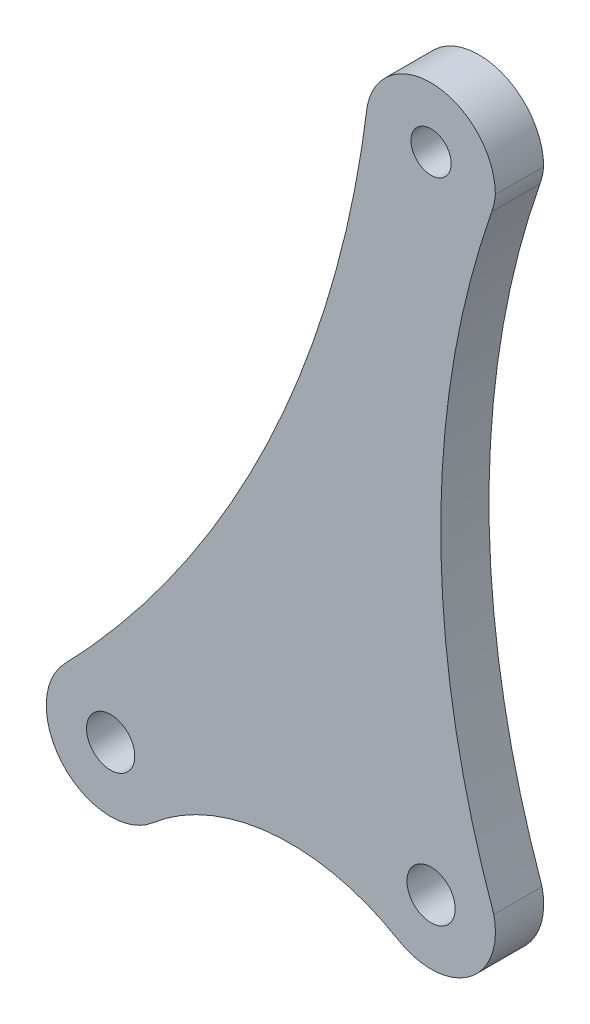
ISO-10303-21;
HEADER;
FILE_DESCRIPTION(('STEP AP214'),'2;1');
FILE_NAME('part.step','',(''),(''),'','','');
FILE_SCHEMA(('AUTOMOTIVE_DESIGN { 1 0 10303 214 1 1 1 1 }'));
ENDSEC;
DATA;
#1=APPLICATION_CONTEXT('core data for automotive mechanical design processes');
#2=APPLICATION_PROTOCOL_DEFINITION('international standard','automotive_design',2000,#1);
#3=PRODUCT_CONTEXT('',#1,'mechanical');
#4=PRODUCT('Part','Part','',(#3));
#5=PRODUCT_RELATED_PRODUCT_CATEGORY('part','',(#4));
#6=PRODUCT_DEFINITION_FORMATION('','',#4);
#7=PRODUCT_DEFINITION_CONTEXT('part definition',#1,'design');
#8=PRODUCT_DEFINITION('design','',#6,#7);
#9=PRODUCT_DEFINITION_SHAPE('','',#8);
#10=(LENGTH_UNIT() NAMED_UNIT(*) SI_UNIT(.MILLI.,.METRE.));
#11=(NAMED_UNIT(*) PLANE_ANGLE_UNIT() SI_UNIT($,.RADIAN.));
#12=(NAMED_UNIT(*) SI_UNIT($,.STERADIAN.) SOLID_ANGLE_UNIT());
#13=UNCERTAINTY_MEASURE_WITH_UNIT(LENGTH_MEASURE(1.E-05),#10,'distance_accuracy_value','');
#14=(GEOMETRIC_REPRESENTATION_CONTEXT(3) GLOBAL_UNCERTAINTY_ASSIGNED_CONTEXT((#13)) GLOBAL_UNIT_ASSIGNED_CONTEXT((#10,
#11,#12)) REPRESENTATION_CONTEXT('',''));
#15=CARTESIAN_POINT('',(0.,0.,0.));
#16=DIRECTION('',(0.,0.,1.));
#17=DIRECTION('',(1.,0.,0.));
#18=AXIS2_PLACEMENT_3D('',#15,#16,#17);
#19=CARTESIAN_POINT('',(23.6265103089509,92.6258355166875,3.));
#20=DIRECTION('',(0.,0.,-1.));
#21=DIRECTION('',(-1.,0.,0.));
#22=AXIS2_PLACEMENT_3D('',#19,#20,#21);
#23=PLANE('',#22);
#24=CARTESIAN_POINT('',(28.0009892525364,100.002534828197,3.));
#25=DIRECTION('',(0.,0.,1.));
#26=DIRECTION('',(-1.,0.,0.));
#27=AXIS2_PLACEMENT_3D('',#24,#25,#26);
#28=CIRCLE('',#27,4.00096595129675);
#29=CARTESIAN_POINT('',(25.9594409642448,96.561632456724,3.));
#30=VERTEX_POINT('',#29);
#31=CARTESIAN_POINT('',(31.9,100.9,3.));
#32=VERTEX_POINT('',#31);
#33=EDGE_CURVE('E137',#30,#32,#28,.T.);
#34=ORIENTED_EDGE('',*,*,#33,.T.);
#35=CARTESIAN_POINT('',(85.3620329454572,119.967387334482,3.));
#36=DIRECTION('',(0.,0.,-1.));
#37=DIRECTION('',(1.,0.,0.));
#38=AXIS2_PLACEMENT_3D('',#35,#36,#37);
#39=CIRCLE('',#38,56.7604988211371);
#40=CARTESIAN_POINT('',(31.7717561186666,138.671302861778,3.));
#41=VERTEX_POINT('',#40);
#42=EDGE_CURVE('E90',#32,#41,#39,.T.);
#43=ORIENTED_EDGE('',*,*,#42,.T.);
#44=CARTESIAN_POINT('',(27.5678212118463,140.138547444851,3.));
#45=DIRECTION('',(0.,0.,1.));
#46=DIRECTION('',(-1.,0.,0.));
#47=AXIS2_PLACEMENT_3D('',#44,#45,#46);
#48=CIRCLE('',#47,4.45262567114472);
#49=CARTESIAN_POINT('',(32.0005087201422,139.717647431623,3.));
#50=VERTEX_POINT('',#49);
#51=EDGE_CURVE('E149',#41,#50,#48,.T.);
#52=ORIENTED_EDGE('',*,*,#51,.T.);
#53=CARTESIAN_POINT('',(27.976753798876,139.709113533065,3.));
#54=DIRECTION('',(0.,0.,1.));
#55=DIRECTION('',(-1.,0.,0.));
#56=AXIS2_PLACEMENT_3D('',#53,#54,#55);
#57=CIRCLE('',#56,4.02376397094046);
#58=CARTESIAN_POINT('',(24.0296582334115,140.490850759331,3.));
#59=VERTEX_POINT('',#58);
#60=EDGE_CURVE('E106',#50,#59,#57,.T.);
#61=ORIENTED_EDGE('',*,*,#60,.T.);
#62=CARTESIAN_POINT('',(-44.3435391340727,148.905424388532,3.));
#63=DIRECTION('',(0.,0.,-1.));
#64=DIRECTION('',(1.,0.,0.));
#65=AXIS2_PLACEMENT_3D('',#62,#63,#64);
#66=CIRCLE('',#65,68.8890351769728);
#67=CARTESIAN_POINT('',(5.19929151411347,101.038869269333,3.));
#68=VERTEX_POINT('',#67);
#69=EDGE_CURVE('E100',#59,#68,#66,.T.);
#70=ORIENTED_EDGE('',*,*,#69,.T.);
#71=CARTESIAN_POINT('',(8.07563299976112,98.2591968162362,3.));
#72=DIRECTION('',(0.,0.,1.));
#73=DIRECTION('',(1.,0.,0.));
#74=AXIS2_PLACEMENT_3D('',#71,#72,#73);
#75=CIRCLE('',#74,3.99998991105752);
#76=CARTESIAN_POINT('',(10.6820969431933,95.2250140596855,3.));
#77=VERTEX_POINT('',#76);
#78=EDGE_CURVE('E104',#68,#77,#75,.T.);
#79=ORIENTED_EDGE('',*,*,#78,.T.);
#80=CARTESIAN_POINT('',(19.2520313653654,85.2491362051779,3.));
#81=DIRECTION('',(0.,0.,-1.));
#82=DIRECTION('',(1.,0.,0.));
#83=AXIS2_PLACEMENT_3D('',#80,#81,#82);
#84=CIRCLE('',#83,13.1514985826097);
#85=EDGE_CURVE('E50',#77,#30,#84,.T.);
#86=ORIENTED_EDGE('',*,*,#85,.T.);
#87=EDGE_LOOP('',(#34,#43,#52,#61,#70,#79,#86));
#88=FACE_BOUND('',#87,.T.);
#89=CARTESIAN_POINT('',(27.9996711600125,140.00224351471,3.));
#90=DIRECTION('',(0.,0.,1.));
#91=DIRECTION('',(1.,0.,0.));
#92=AXIS2_PLACEMENT_3D('',#89,#90,#91);
#93=CIRCLE('',#92,1.25000000000001);
#94=CARTESIAN_POINT('',(29.2496711600126,140.00224351471,3.));
#95=VERTEX_POINT('',#94);
#96=EDGE_CURVE('E128',#95,#95,#93,.T.);
#97=ORIENTED_EDGE('',*,*,#96,.F.);
#98=EDGE_LOOP('',(#97));
#99=FACE_BOUND('',#98,.T.);
#100=CARTESIAN_POINT('',(8.07561116786086,98.2592968022569,3.));
#101=DIRECTION('',(0.,0.,1.));
#102=DIRECTION('',(1.,0.,0.));
#103=AXIS2_PLACEMENT_3D('',#100,#101,#102);
#104=CIRCLE('',#103,1.50000000000001);
#105=CARTESIAN_POINT('',(9.57561116786087,98.2592968022569,3.));
#106=VERTEX_POINT('',#105);
#107=EDGE_CURVE('E164',#106,#106,#104,.T.);
#108=ORIENTED_EDGE('',*,*,#107,.F.);
#109=EDGE_LOOP('',(#108));
#110=FACE_BOUND('',#109,.T.);
#111=CARTESIAN_POINT('',(27.9995484159628,100.00220000214,3.));
#112=DIRECTION('',(0.,0.,1.));
#113=DIRECTION('',(1.,0.,0.));
#114=AXIS2_PLACEMENT_3D('',#111,#112,#113);
#115=CIRCLE('',#114,1.5);
#116=CARTESIAN_POINT('',(29.4995484159629,100.00220000214,3.));
#117=VERTEX_POINT('',#116);
#118=EDGE_CURVE('E170',#117,#117,#115,.T.);
#119=ORIENTED_EDGE('',*,*,#118,.F.);
#120=EDGE_LOOP('',(#119));
#121=FACE_BOUND('',#120,.T.);
#122=ADVANCED_FACE('F33',(#88,#99,#110,#121),#23,.F.);
#123=CARTESIAN_POINT('',(23.6265103089509,92.6258355166875,0.));
#124=DIRECTION('',(0.,0.,-1.));
#125=DIRECTION('',(-1.,0.,0.));
#126=AXIS2_PLACEMENT_3D('',#123,#124,#125);
#127=PLANE('',#126);
#128=CARTESIAN_POINT('',(8.07561116786086,98.2592968022569,0.));
#129=DIRECTION('',(0.,0.,1.));
#130=DIRECTION('',(1.,0.,0.));
#131=AXIS2_PLACEMENT_3D('',#128,#129,#130);
#132=CIRCLE('',#131,1.50000000000001);
#133=CARTESIAN_POINT('',(9.57561116786087,98.2592968022569,0.));
#134=VERTEX_POINT('',#133);
#135=EDGE_CURVE('E167',#134,#134,#132,.T.);
#136=ORIENTED_EDGE('',*,*,#135,.T.);
#137=EDGE_LOOP('',(#136));
#138=FACE_BOUND('',#137,.T.);
#139=CARTESIAN_POINT('',(28.0009892525364,100.002534828197,0.));
#140=DIRECTION('',(0.,0.,1.));
#141=DIRECTION('',(-1.,0.,0.));
#142=AXIS2_PLACEMENT_3D('',#139,#140,#141);
#143=CIRCLE('',#142,4.00096595129675);
#144=CARTESIAN_POINT('',(25.9594409642448,96.561632456724,0.));
#145=VERTEX_POINT('',#144);
#146=CARTESIAN_POINT('',(31.9,100.9,0.));
#147=VERTEX_POINT('',#146);
#148=EDGE_CURVE('E124',#145,#147,#143,.T.);
#149=ORIENTED_EDGE('',*,*,#148,.F.);
#150=CARTESIAN_POINT('',(19.2520313653654,85.2491362051779,0.));
#151=DIRECTION('',(0.,0.,-1.));
#152=DIRECTION('',(1.,0.,0.));
#153=AXIS2_PLACEMENT_3D('',#150,#151,#152);
#154=CIRCLE('',#153,13.1514985826097);
#155=CARTESIAN_POINT('',(10.6820969431933,95.2250140596855,0.));
#156=VERTEX_POINT('',#155);
#157=EDGE_CURVE('E82',#156,#145,#154,.T.);
#158=ORIENTED_EDGE('',*,*,#157,.F.);
#159=CARTESIAN_POINT('',(8.07563299976112,98.2591968162362,0.));
#160=DIRECTION('',(0.,0.,1.));
#161=DIRECTION('',(1.,0.,0.));
#162=AXIS2_PLACEMENT_3D('',#159,#160,#161);
#163=CIRCLE('',#162,3.99998991105752);
#164=CARTESIAN_POINT('',(5.19929151411347,101.038869269333,0.));
#165=VERTEX_POINT('',#164);
#166=EDGE_CURVE('E76',#165,#156,#163,.T.);
#167=ORIENTED_EDGE('',*,*,#166,.F.);
#168=CARTESIAN_POINT('',(-44.3435391340727,148.905424388532,0.));
#169=DIRECTION('',(0.,0.,-1.));
#170=DIRECTION('',(1.,0.,0.));
#171=AXIS2_PLACEMENT_3D('',#168,#169,#170);
#172=CIRCLE('',#171,68.8890351769728);
#173=CARTESIAN_POINT('',(24.0296582334115,140.490850759331,0.));
#174=VERTEX_POINT('',#173);
#175=EDGE_CURVE('E114',#174,#165,#172,.T.);
#176=ORIENTED_EDGE('',*,*,#175,.F.);
#177=CARTESIAN_POINT('',(27.976753798876,139.709113533065,0.));
#178=DIRECTION('',(0.,0.,1.));
#179=DIRECTION('',(-1.,0.,0.));
#180=AXIS2_PLACEMENT_3D('',#177,#178,#179);
#181=CIRCLE('',#180,4.02376397094046);
#182=CARTESIAN_POINT('',(32.0005087201422,139.717647431623,0.));
#183=VERTEX_POINT('',#182);
#184=EDGE_CURVE('E132',#183,#174,#181,.T.);
#185=ORIENTED_EDGE('',*,*,#184,.F.);
#186=CARTESIAN_POINT('',(27.5678212118463,140.138547444851,0.));
#187=DIRECTION('',(0.,0.,1.));
#188=DIRECTION('',(-1.,0.,0.));
#189=AXIS2_PLACEMENT_3D('',#186,#187,#188);
#190=CIRCLE('',#189,4.45262567114472);
#191=CARTESIAN_POINT('',(31.7717561186666,138.671302861778,0.));
#192=VERTEX_POINT('',#191);
#193=EDGE_CURVE('E130',#192,#183,#190,.T.);
#194=ORIENTED_EDGE('',*,*,#193,.F.);
#195=CARTESIAN_POINT('',(85.3620329454572,119.967387334482,0.));
#196=DIRECTION('',(0.,0.,-1.));
#197=DIRECTION('',(1.,0.,0.));
#198=AXIS2_PLACEMENT_3D('',#195,#196,#197);
#199=CIRCLE('',#198,56.7604988211371);
#200=EDGE_CURVE('E127',#147,#192,#199,.T.);
#201=ORIENTED_EDGE('',*,*,#200,.F.);
#202=EDGE_LOOP('',(#149,#158,#167,#176,#185,#194,#201));
#203=FACE_BOUND('',#202,.T.);
#204=CARTESIAN_POINT('',(27.9996711600125,140.00224351471,0.));
#205=DIRECTION('',(0.,0.,1.));
#206=DIRECTION('',(1.,0.,0.));
#207=AXIS2_PLACEMENT_3D('',#204,#205,#206);
#208=CIRCLE('',#207,1.25000000000001);
#209=CARTESIAN_POINT('',(29.2496711600126,140.00224351471,0.));
#210=VERTEX_POINT('',#209);
#211=EDGE_CURVE('E161',#210,#210,#208,.T.);
#212=ORIENTED_EDGE('',*,*,#211,.T.);
#213=EDGE_LOOP('',(#212));
#214=FACE_BOUND('',#213,.T.);
#215=CARTESIAN_POINT('',(27.9995484159628,100.00220000214,0.));
#216=DIRECTION('',(0.,0.,1.));
#217=DIRECTION('',(1.,0.,0.));
#218=AXIS2_PLACEMENT_3D('',#215,#216,#217);
#219=CIRCLE('',#218,1.5);
#220=CARTESIAN_POINT('',(29.4995484159629,100.00220000214,0.));
#221=VERTEX_POINT('',#220);
#222=EDGE_CURVE('E173',#221,#221,#219,.T.);
#223=ORIENTED_EDGE('',*,*,#222,.T.);
#224=EDGE_LOOP('',(#223));
#225=FACE_BOUND('',#224,.T.);
#226=ADVANCED_FACE('F153',(#138,#203,#214,#225),#127,.T.);
#227=CARTESIAN_POINT('',(28.0009892525364,100.002534828197,3.));
#228=DIRECTION('',(0.,0.,-1.));
#229=DIRECTION('',(-1.,0.,0.));
#230=AXIS2_PLACEMENT_3D('',#227,#228,#229);
#231=CYLINDRICAL_SURFACE('',#230,4.00096595129675);
#232=ORIENTED_EDGE('',*,*,#148,.T.);
#233=DIRECTION('',(0.,0.,-1.));
#234=VECTOR('',#233,1.);
#235=CARTESIAN_POINT('',(31.9,100.9,3.));
#236=LINE('',#235,#234);
#237=EDGE_CURVE('E11',#32,#147,#236,.T.);
#238=ORIENTED_EDGE('',*,*,#237,.F.);
#239=ORIENTED_EDGE('',*,*,#33,.F.);
#240=DIRECTION('',(0.,0.,-1.));
#241=VECTOR('',#240,1.);
#242=CARTESIAN_POINT('',(25.9594409642448,96.561632456724,3.));
#243=LINE('',#242,#241);
#244=EDGE_CURVE('E120',#30,#145,#243,.T.);
#245=ORIENTED_EDGE('',*,*,#244,.T.);
#246=EDGE_LOOP('',(#232,#238,#239,#245));
#247=FACE_BOUND('',#246,.T.);
#248=ADVANCED_FACE('F35',(#247),#231,.T.);
#249=CARTESIAN_POINT('',(85.3620329454572,119.967387334482,3.));
#250=DIRECTION('',(0.,0.,-1.));
#251=DIRECTION('',(-1.,0.,0.));
#252=AXIS2_PLACEMENT_3D('',#249,#250,#251);
#253=CYLINDRICAL_SURFACE('',#252,56.7604988211371);
#254=ORIENTED_EDGE('',*,*,#200,.T.);
#255=DIRECTION('',(0.,0.,-1.));
#256=VECTOR('',#255,1.);
#257=CARTESIAN_POINT('',(31.7717561186666,138.671302861778,3.));
#258=LINE('',#257,#256);
#259=EDGE_CURVE('E42',#41,#192,#258,.T.);
#260=ORIENTED_EDGE('',*,*,#259,.F.);
#261=ORIENTED_EDGE('',*,*,#42,.F.);
#262=ORIENTED_EDGE('',*,*,#237,.T.);
#263=EDGE_LOOP('',(#254,#260,#261,#262));
#264=FACE_BOUND('',#263,.T.);
#265=ADVANCED_FACE('F203',(#264),#253,.F.);
#266=CARTESIAN_POINT('',(27.5678212118463,140.138547444851,3.));
#267=DIRECTION('',(0.,0.,-1.));
#268=DIRECTION('',(-1.,0.,0.));
#269=AXIS2_PLACEMENT_3D('',#266,#267,#268);
#270=CYLINDRICAL_SURFACE('',#269,4.45262567114472);
#271=ORIENTED_EDGE('',*,*,#193,.T.);
#272=DIRECTION('',(0.,0.,-1.));
#273=VECTOR('',#272,1.);
#274=CARTESIAN_POINT('',(32.0005087201422,139.717647431623,3.));
#275=LINE('',#274,#273);
#276=EDGE_CURVE('E141',#50,#183,#275,.T.);
#277=ORIENTED_EDGE('',*,*,#276,.F.);
#278=ORIENTED_EDGE('',*,*,#51,.F.);
#279=ORIENTED_EDGE('',*,*,#259,.T.);
#280=EDGE_LOOP('',(#271,#277,#278,#279));
#281=FACE_BOUND('',#280,.T.);
#282=ADVANCED_FACE('F147',(#281),#270,.T.);
#283=CARTESIAN_POINT('',(27.976753798876,139.709113533065,3.));
#284=DIRECTION('',(0.,0.,-1.));
#285=DIRECTION('',(-1.,0.,0.));
#286=AXIS2_PLACEMENT_3D('',#283,#284,#285);
#287=CYLINDRICAL_SURFACE('',#286,4.02376397094046);
#288=ORIENTED_EDGE('',*,*,#184,.T.);
#289=DIRECTION('',(0.,0.,-1.));
#290=VECTOR('',#289,1.);
#291=CARTESIAN_POINT('',(24.0296582334115,140.490850759331,3.));
#292=LINE('',#291,#290);
#293=EDGE_CURVE('E115',#59,#174,#292,.T.);
#294=ORIENTED_EDGE('',*,*,#293,.F.);
#295=ORIENTED_EDGE('',*,*,#60,.F.);
#296=ORIENTED_EDGE('',*,*,#276,.T.);
#297=EDGE_LOOP('',(#288,#294,#295,#296));
#298=FACE_BOUND('',#297,.T.);
#299=ADVANCED_FACE('F156',(#298),#287,.T.);
#300=CARTESIAN_POINT('',(-44.3435391340727,148.905424388532,3.));
#301=DIRECTION('',(0.,0.,-1.));
#302=DIRECTION('',(-1.,0.,0.));
#303=AXIS2_PLACEMENT_3D('',#300,#301,#302);
#304=CYLINDRICAL_SURFACE('',#303,68.8890351769728);
#305=ORIENTED_EDGE('',*,*,#175,.T.);
#306=DIRECTION('',(0.,0.,-1.));
#307=VECTOR('',#306,1.);
#308=CARTESIAN_POINT('',(5.19929151411347,101.038869269333,3.));
#309=LINE('',#308,#307);
#310=EDGE_CURVE('E111',#68,#165,#309,.T.);
#311=ORIENTED_EDGE('',*,*,#310,.F.);
#312=ORIENTED_EDGE('',*,*,#69,.F.);
#313=ORIENTED_EDGE('',*,*,#293,.T.);
#314=EDGE_LOOP('',(#305,#311,#312,#313));
#315=FACE_BOUND('',#314,.T.);
#316=ADVANCED_FACE('F112',(#315),#304,.F.);
#317=CARTESIAN_POINT('',(8.07563299976112,98.2591968162362,3.));
#318=DIRECTION('',(0.,0.,-1.));
#319=DIRECTION('',(-1.,0.,0.));
#320=AXIS2_PLACEMENT_3D('',#317,#318,#319);
#321=CYLINDRICAL_SURFACE('',#320,3.99998991105752);
#322=ORIENTED_EDGE('',*,*,#166,.T.);
#323=DIRECTION('',(0.,0.,-1.));
#324=VECTOR('',#323,1.);
#325=CARTESIAN_POINT('',(10.6820969431933,95.2250140596855,3.));
#326=LINE('',#325,#324);
#327=EDGE_CURVE('E116',#77,#156,#326,.T.);
#328=ORIENTED_EDGE('',*,*,#327,.F.);
#329=ORIENTED_EDGE('',*,*,#78,.F.);
#330=ORIENTED_EDGE('',*,*,#310,.T.);
#331=EDGE_LOOP('',(#322,#328,#329,#330));
#332=FACE_BOUND('',#331,.T.);
#333=ADVANCED_FACE('F118',(#332),#321,.T.);
#334=CARTESIAN_POINT('',(19.2520313653654,85.2491362051779,3.));
#335=DIRECTION('',(0.,0.,-1.));
#336=DIRECTION('',(-1.,0.,0.));
#337=AXIS2_PLACEMENT_3D('',#334,#335,#336);
#338=CYLINDRICAL_SURFACE('',#337,13.1514985826097);
#339=ORIENTED_EDGE('',*,*,#157,.T.);
#340=ORIENTED_EDGE('',*,*,#244,.F.);
#341=ORIENTED_EDGE('',*,*,#85,.F.);
#342=ORIENTED_EDGE('',*,*,#327,.T.);
#343=EDGE_LOOP('',(#339,#340,#341,#342));
#344=FACE_BOUND('',#343,.T.);
#345=ADVANCED_FACE('F193',(#344),#338,.F.);
#346=CARTESIAN_POINT('',(27.9996711600125,140.00224351471,3.));
#347=DIRECTION('',(0.,0.,-1.));
#348=DIRECTION('',(-1.,0.,0.));
#349=AXIS2_PLACEMENT_3D('',#346,#347,#348);
#350=CYLINDRICAL_SURFACE('',#349,1.25000000000001);
#351=ORIENTED_EDGE('',*,*,#96,.T.);
#352=EDGE_LOOP('',(#351));
#353=FACE_BOUND('',#352,.T.);
#354=ORIENTED_EDGE('',*,*,#211,.F.);
#355=EDGE_LOOP('',(#354));
#356=FACE_BOUND('',#355,.T.);
#357=ADVANCED_FACE('F190',(#353,#356),#350,.F.);
#358=CARTESIAN_POINT('',(8.07561116786086,98.2592968022569,3.));
#359=DIRECTION('',(0.,0.,-1.));
#360=DIRECTION('',(-1.,0.,0.));
#361=AXIS2_PLACEMENT_3D('',#358,#359,#360);
#362=CYLINDRICAL_SURFACE('',#361,1.50000000000001);
#363=ORIENTED_EDGE('',*,*,#107,.T.);
#364=EDGE_LOOP('',(#363));
#365=FACE_BOUND('',#364,.T.);
#366=ORIENTED_EDGE('',*,*,#135,.F.);
#367=EDGE_LOOP('',(#366));
#368=FACE_BOUND('',#367,.T.);
#369=ADVANCED_FACE('F262',(#365,#368),#362,.F.);
#370=CARTESIAN_POINT('',(27.9995484159628,100.00220000214,3.));
#371=DIRECTION('',(0.,0.,-1.));
#372=DIRECTION('',(-1.,0.,0.));
#373=AXIS2_PLACEMENT_3D('',#370,#371,#372);
#374=CYLINDRICAL_SURFACE('',#373,1.5);
#375=ORIENTED_EDGE('',*,*,#118,.T.);
#376=EDGE_LOOP('',(#375));
#377=FACE_BOUND('',#376,.T.);
#378=ORIENTED_EDGE('',*,*,#222,.F.);
#379=EDGE_LOOP('',(#378));
#380=FACE_BOUND('',#379,.T.);
#381=ADVANCED_FACE('F179',(#377,#380),#374,.F.);
#382=CLOSED_SHELL('',(#122,#226,#248,#265,#282,#299,#316,#333,#345,#357,#369,#381));
#383=MANIFOLD_SOLID_BREP('B2',#382);
#384=ADVANCED_BREP_SHAPE_REPRESENTATION('',(#18,#383),#14);
#385=SHAPE_DEFINITION_REPRESENTATION(#9,#384);
ENDSEC;
END-ISO-10303-21;
